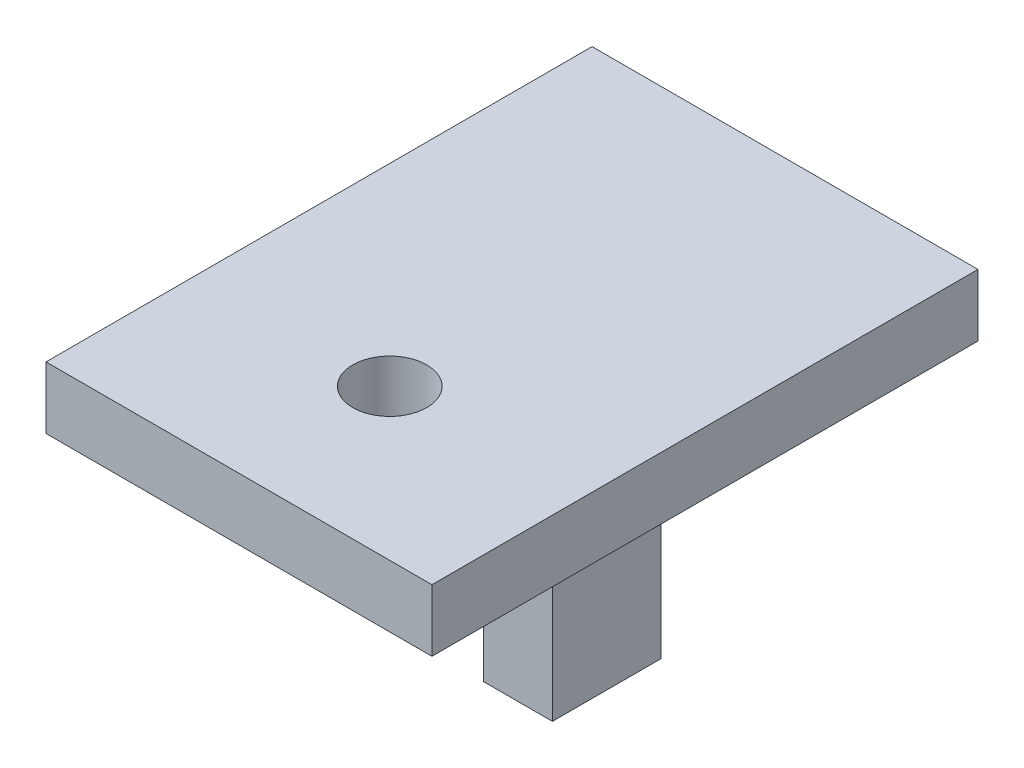
ISO-10303-21;
HEADER;
FILE_DESCRIPTION(('STEP AP214'),'2;1');
FILE_NAME('part.step','',(''),(''),'','','');
FILE_SCHEMA(('AUTOMOTIVE_DESIGN { 1 0 10303 214 1 1 1 1 }'));
ENDSEC;
DATA;
#1=APPLICATION_CONTEXT('core data for automotive mechanical design processes');
#2=APPLICATION_PROTOCOL_DEFINITION('international standard','automotive_design',2000,#1);
#3=PRODUCT_CONTEXT('',#1,'mechanical');
#4=PRODUCT('Part','Part','',(#3));
#5=PRODUCT_RELATED_PRODUCT_CATEGORY('part','',(#4));
#6=PRODUCT_DEFINITION_FORMATION('','',#4);
#7=PRODUCT_DEFINITION_CONTEXT('part definition',#1,'design');
#8=PRODUCT_DEFINITION('design','',#6,#7);
#9=PRODUCT_DEFINITION_SHAPE('','',#8);
#10=(LENGTH_UNIT() NAMED_UNIT(*) SI_UNIT(.MILLI.,.METRE.));
#11=(NAMED_UNIT(*) PLANE_ANGLE_UNIT() SI_UNIT($,.RADIAN.));
#12=(NAMED_UNIT(*) SI_UNIT($,.STERADIAN.) SOLID_ANGLE_UNIT());
#13=UNCERTAINTY_MEASURE_WITH_UNIT(LENGTH_MEASURE(1.E-05),#10,'distance_accuracy_value','');
#14=(GEOMETRIC_REPRESENTATION_CONTEXT(3) GLOBAL_UNCERTAINTY_ASSIGNED_CONTEXT((#13)) GLOBAL_UNIT_ASSIGNED_CONTEXT((#10,
#11,#12)) REPRESENTATION_CONTEXT('',''));
#15=CARTESIAN_POINT('',(0.,0.,0.));
#16=DIRECTION('',(0.,0.,1.));
#17=DIRECTION('',(1.,0.,0.));
#18=AXIS2_PLACEMENT_3D('',#15,#16,#17);
#19=CARTESIAN_POINT('',(0.,0.,0.));
#20=DIRECTION('',(0.,1.,0.));
#21=DIRECTION('',(0.,0.,1.));
#22=AXIS2_PLACEMENT_3D('',#19,#20,#21);
#23=PLANE('',#22);
#24=CARTESIAN_POINT('',(0.,0.,23.217935));
#25=DIRECTION('',(0.,1.,0.));
#26=DIRECTION('',(0.,0.,1.));
#27=AXIS2_PLACEMENT_3D('',#24,#25,#26);
#28=CIRCLE('',#27,5.969);
#29=CARTESIAN_POINT('',(0.,0.,29.186935));
#30=VERTEX_POINT('',#29);
#31=EDGE_CURVE('E121',#30,#30,#28,.T.);
#32=ORIENTED_EDGE('',*,*,#31,.T.);
#33=EDGE_LOOP('',(#32));
#34=FACE_BOUND('',#33,.T.);
#35=DIRECTION('',(0.,0.,1.));
#36=VECTOR('',#35,1.);
#37=CARTESIAN_POINT('',(-20.01,0.,-40.492065));
#38=LINE('',#37,#36);
#39=CARTESIAN_POINT('',(-20.01,0.,-40.492065));
#40=VERTEX_POINT('',#39);
#41=CARTESIAN_POINT('',(-20.01,0.,-23.009425));
#42=VERTEX_POINT('',#41);
#43=EDGE_CURVE('E59',#40,#42,#38,.T.);
#44=ORIENTED_EDGE('',*,*,#43,.F.);
#45=DIRECTION('',(-1.,0.,0.));
#46=VECTOR('',#45,1.);
#47=CARTESIAN_POINT('',(-31.1,0.,-40.492065));
#48=LINE('',#47,#46);
#49=CARTESIAN_POINT('',(31.1,0.,-40.492065));
#50=VERTEX_POINT('',#49);
#51=EDGE_CURVE('E143',#50,#40,#48,.T.);
#52=ORIENTED_EDGE('',*,*,#51,.F.);
#53=DIRECTION('',(0.,0.,-1.));
#54=VECTOR('',#53,1.);
#55=CARTESIAN_POINT('',(31.1,0.,-40.492065));
#56=LINE('',#55,#54);
#57=CARTESIAN_POINT('',(31.1,0.,47.517935));
#58=VERTEX_POINT('',#57);
#59=EDGE_CURVE('E128',#58,#50,#56,.T.);
#60=ORIENTED_EDGE('',*,*,#59,.F.);
#61=DIRECTION('',(1.,0.,0.));
#62=VECTOR('',#61,1.);
#63=CARTESIAN_POINT('',(-31.1,0.,47.517935));
#64=LINE('',#63,#62);
#65=CARTESIAN_POINT('',(-31.1,0.,47.517935));
#66=VERTEX_POINT('',#65);
#67=EDGE_CURVE('E134',#66,#58,#64,.T.);
#68=ORIENTED_EDGE('',*,*,#67,.F.);
#69=DIRECTION('',(0.,0.,1.));
#70=VECTOR('',#69,1.);
#71=CARTESIAN_POINT('',(-31.1,0.,-40.492065));
#72=LINE('',#71,#70);
#73=CARTESIAN_POINT('',(-31.1,0.,-23.009425));
#74=VERTEX_POINT('',#73);
#75=EDGE_CURVE('E145',#74,#66,#72,.T.);
#76=ORIENTED_EDGE('',*,*,#75,.F.);
#77=DIRECTION('',(-1.,0.,0.));
#78=VECTOR('',#77,1.);
#79=CARTESIAN_POINT('',(-20.01,0.,-23.009425));
#80=LINE('',#79,#78);
#81=EDGE_CURVE('E54',#42,#74,#80,.T.);
#82=ORIENTED_EDGE('',*,*,#81,.F.);
#83=EDGE_LOOP('',(#44,#52,#60,#68,#76,#82));
#84=FACE_BOUND('',#83,.T.);
#85=ADVANCED_FACE('F39',(#34,#84),#23,.F.);
#86=CARTESIAN_POINT('',(31.1,10.,-40.492065));
#87=DIRECTION('',(-1.,0.,0.));
#88=DIRECTION('',(0.,0.,1.));
#89=AXIS2_PLACEMENT_3D('',#86,#87,#88);
#90=PLANE('',#89);
#91=ORIENTED_EDGE('',*,*,#59,.T.);
#92=DIRECTION('',(0.,-1.,0.));
#93=VECTOR('',#92,1.);
#94=CARTESIAN_POINT('',(31.1,10.,-40.492065));
#95=LINE('',#94,#93);
#96=CARTESIAN_POINT('',(31.1,10.,-40.492065));
#97=VERTEX_POINT('',#96);
#98=EDGE_CURVE('E11',#97,#50,#95,.T.);
#99=ORIENTED_EDGE('',*,*,#98,.F.);
#100=DIRECTION('',(0.,0.,-1.));
#101=VECTOR('',#100,1.);
#102=CARTESIAN_POINT('',(31.1,10.,-40.492065));
#103=LINE('',#102,#101);
#104=CARTESIAN_POINT('',(31.1,10.,47.517935));
#105=VERTEX_POINT('',#104);
#106=EDGE_CURVE('E130',#105,#97,#103,.T.);
#107=ORIENTED_EDGE('',*,*,#106,.F.);
#108=DIRECTION('',(0.,-1.,0.));
#109=VECTOR('',#108,1.);
#110=CARTESIAN_POINT('',(31.1,10.,47.517935));
#111=LINE('',#110,#109);
#112=EDGE_CURVE('E140',#105,#58,#111,.T.);
#113=ORIENTED_EDGE('',*,*,#112,.T.);
#114=EDGE_LOOP('',(#91,#99,#107,#113));
#115=FACE_BOUND('',#114,.T.);
#116=ADVANCED_FACE('F41',(#115),#90,.F.);
#117=CARTESIAN_POINT('',(-31.1,10.,-40.492065));
#118=DIRECTION('',(0.,0.,1.));
#119=DIRECTION('',(1.,0.,0.));
#120=AXIS2_PLACEMENT_3D('',#117,#118,#119);
#121=PLANE('',#120);
#122=ORIENTED_EDGE('',*,*,#51,.T.);
#123=DIRECTION('',(0.,1.,0.));
#124=VECTOR('',#123,1.);
#125=CARTESIAN_POINT('',(-20.01,-69.9,-40.492065));
#126=LINE('',#125,#124);
#127=CARTESIAN_POINT('',(-20.01,-69.9,-40.492065));
#128=VERTEX_POINT('',#127);
#129=EDGE_CURVE('E123',#128,#40,#126,.T.);
#130=ORIENTED_EDGE('',*,*,#129,.F.);
#131=DIRECTION('',(1.,0.,0.));
#132=VECTOR('',#131,1.);
#133=CARTESIAN_POINT('',(-20.01,-69.9,-40.492065));
#134=LINE('',#133,#132);
#135=CARTESIAN_POINT('',(-31.1,-69.9,-40.492065));
#136=VERTEX_POINT('',#135);
#137=EDGE_CURVE('E112',#136,#128,#134,.T.);
#138=ORIENTED_EDGE('',*,*,#137,.F.);
#139=DIRECTION('',(0.,-1.,0.));
#140=VECTOR('',#139,1.);
#141=CARTESIAN_POINT('',(-31.1,10.,-40.492065));
#142=LINE('',#141,#140);
#143=CARTESIAN_POINT('',(-31.1,10.,-40.492065));
#144=VERTEX_POINT('',#143);
#145=EDGE_CURVE('E47',#144,#136,#142,.T.);
#146=ORIENTED_EDGE('',*,*,#145,.F.);
#147=DIRECTION('',(-1.,0.,0.));
#148=VECTOR('',#147,1.);
#149=CARTESIAN_POINT('',(-31.1,10.,-40.492065));
#150=LINE('',#149,#148);
#151=EDGE_CURVE('E133',#97,#144,#150,.T.);
#152=ORIENTED_EDGE('',*,*,#151,.F.);
#153=ORIENTED_EDGE('',*,*,#98,.T.);
#154=EDGE_LOOP('',(#122,#130,#138,#146,#152,#153));
#155=FACE_BOUND('',#154,.T.);
#156=ADVANCED_FACE('F159',(#155),#121,.F.);
#157=CARTESIAN_POINT('',(-31.1,10.,-40.492065));
#158=DIRECTION('',(1.,0.,0.));
#159=DIRECTION('',(0.,0.,-1.));
#160=AXIS2_PLACEMENT_3D('',#157,#158,#159);
#161=PLANE('',#160);
#162=ORIENTED_EDGE('',*,*,#145,.T.);
#163=DIRECTION('',(0.,0.,-1.));
#164=VECTOR('',#163,1.);
#165=CARTESIAN_POINT('',(-31.1,-69.9,-40.492065));
#166=LINE('',#165,#164);
#167=CARTESIAN_POINT('',(-31.1,-69.9,-23.009425));
#168=VERTEX_POINT('',#167);
#169=EDGE_CURVE('E106',#168,#136,#166,.T.);
#170=ORIENTED_EDGE('',*,*,#169,.F.);
#171=DIRECTION('',(0.,1.,0.));
#172=VECTOR('',#171,1.);
#173=CARTESIAN_POINT('',(-31.1,-69.9,-23.009425));
#174=LINE('',#173,#172);
#175=EDGE_CURVE('E102',#168,#74,#174,.T.);
#176=ORIENTED_EDGE('',*,*,#175,.T.);
#177=ORIENTED_EDGE('',*,*,#75,.T.);
#178=DIRECTION('',(0.,-1.,0.));
#179=VECTOR('',#178,1.);
#180=CARTESIAN_POINT('',(-31.1,10.,47.517935));
#181=LINE('',#180,#179);
#182=CARTESIAN_POINT('',(-31.1,10.,47.517935));
#183=VERTEX_POINT('',#182);
#184=EDGE_CURVE('E150',#183,#66,#181,.T.);
#185=ORIENTED_EDGE('',*,*,#184,.F.);
#186=DIRECTION('',(0.,0.,1.));
#187=VECTOR('',#186,1.);
#188=CARTESIAN_POINT('',(-31.1,10.,-40.492065));
#189=LINE('',#188,#187);
#190=EDGE_CURVE('E136',#144,#183,#189,.T.);
#191=ORIENTED_EDGE('',*,*,#190,.F.);
#192=EDGE_LOOP('',(#162,#170,#176,#177,#185,#191));
#193=FACE_BOUND('',#192,.T.);
#194=ADVANCED_FACE('F155',(#193),#161,.F.);
#195=CARTESIAN_POINT('',(-31.1,10.,47.517935));
#196=DIRECTION('',(0.,0.,-1.));
#197=DIRECTION('',(-1.,0.,0.));
#198=AXIS2_PLACEMENT_3D('',#195,#196,#197);
#199=PLANE('',#198);
#200=ORIENTED_EDGE('',*,*,#67,.T.);
#201=ORIENTED_EDGE('',*,*,#112,.F.);
#202=DIRECTION('',(1.,0.,0.));
#203=VECTOR('',#202,1.);
#204=CARTESIAN_POINT('',(-31.1,10.,47.517935));
#205=LINE('',#204,#203);
#206=EDGE_CURVE('E138',#183,#105,#205,.T.);
#207=ORIENTED_EDGE('',*,*,#206,.F.);
#208=ORIENTED_EDGE('',*,*,#184,.T.);
#209=EDGE_LOOP('',(#200,#201,#207,#208));
#210=FACE_BOUND('',#209,.T.);
#211=ADVANCED_FACE('F166',(#210),#199,.F.);
#212=CARTESIAN_POINT('',(0.,10.,0.));
#213=DIRECTION('',(0.,1.,0.));
#214=DIRECTION('',(0.,0.,1.));
#215=AXIS2_PLACEMENT_3D('',#212,#213,#214);
#216=PLANE('',#215);
#217=CARTESIAN_POINT('',(0.,10.,23.217935));
#218=DIRECTION('',(0.,1.,0.));
#219=DIRECTION('',(0.,0.,1.));
#220=AXIS2_PLACEMENT_3D('',#217,#218,#219);
#221=CIRCLE('',#220,5.969);
#222=CARTESIAN_POINT('',(0.,10.,29.186935));
#223=VERTEX_POINT('',#222);
#224=EDGE_CURVE('E118',#223,#223,#221,.T.);
#225=ORIENTED_EDGE('',*,*,#224,.F.);
#226=EDGE_LOOP('',(#225));
#227=FACE_BOUND('',#226,.T.);
#228=ORIENTED_EDGE('',*,*,#106,.T.);
#229=ORIENTED_EDGE('',*,*,#151,.T.);
#230=ORIENTED_EDGE('',*,*,#190,.T.);
#231=ORIENTED_EDGE('',*,*,#206,.T.);
#232=EDGE_LOOP('',(#228,#229,#230,#231));
#233=FACE_BOUND('',#232,.T.);
#234=ADVANCED_FACE('F173',(#227,#233),#216,.T.);
#235=CARTESIAN_POINT('',(0.,0.,23.217935));
#236=DIRECTION('',(0.,1.,0.));
#237=DIRECTION('',(0.,0.,1.));
#238=AXIS2_PLACEMENT_3D('',#235,#236,#237);
#239=CYLINDRICAL_SURFACE('',#238,5.969);
#240=ORIENTED_EDGE('',*,*,#31,.F.);
#241=EDGE_LOOP('',(#240));
#242=FACE_BOUND('',#241,.T.);
#243=ORIENTED_EDGE('',*,*,#224,.T.);
#244=EDGE_LOOP('',(#243));
#245=FACE_BOUND('',#244,.T.);
#246=ADVANCED_FACE('F175',(#242,#245),#239,.F.);
#247=CARTESIAN_POINT('',(-20.01,-69.9,-40.492065));
#248=DIRECTION('',(-1.,0.,0.));
#249=DIRECTION('',(0.,0.,1.));
#250=AXIS2_PLACEMENT_3D('',#247,#248,#249);
#251=PLANE('',#250);
#252=ORIENTED_EDGE('',*,*,#43,.T.);
#253=DIRECTION('',(0.,1.,0.));
#254=VECTOR('',#253,1.);
#255=CARTESIAN_POINT('',(-20.01,-69.9,-23.009425));
#256=LINE('',#255,#254);
#257=CARTESIAN_POINT('',(-20.01,-69.9,-23.009425));
#258=VERTEX_POINT('',#257);
#259=EDGE_CURVE('E100',#258,#42,#256,.T.);
#260=ORIENTED_EDGE('',*,*,#259,.F.);
#261=DIRECTION('',(0.,0.,1.));
#262=VECTOR('',#261,1.);
#263=CARTESIAN_POINT('',(-20.01,-69.9,-40.492065));
#264=LINE('',#263,#262);
#265=EDGE_CURVE('E107',#128,#258,#264,.T.);
#266=ORIENTED_EDGE('',*,*,#265,.F.);
#267=ORIENTED_EDGE('',*,*,#129,.T.);
#268=EDGE_LOOP('',(#252,#260,#266,#267));
#269=FACE_BOUND('',#268,.T.);
#270=ADVANCED_FACE('F117',(#269),#251,.F.);
#271=CARTESIAN_POINT('',(-20.01,-69.9,-23.009425));
#272=DIRECTION('',(0.,0.,-1.));
#273=DIRECTION('',(-1.,0.,0.));
#274=AXIS2_PLACEMENT_3D('',#271,#272,#273);
#275=PLANE('',#274);
#276=ORIENTED_EDGE('',*,*,#81,.T.);
#277=ORIENTED_EDGE('',*,*,#175,.F.);
#278=DIRECTION('',(-1.,0.,0.));
#279=VECTOR('',#278,1.);
#280=CARTESIAN_POINT('',(-20.01,-69.9,-23.009425));
#281=LINE('',#280,#279);
#282=EDGE_CURVE('E96',#258,#168,#281,.T.);
#283=ORIENTED_EDGE('',*,*,#282,.F.);
#284=ORIENTED_EDGE('',*,*,#259,.T.);
#285=EDGE_LOOP('',(#276,#277,#283,#284));
#286=FACE_BOUND('',#285,.T.);
#287=ADVANCED_FACE('F98',(#286),#275,.F.);
#288=CARTESIAN_POINT('',(0.,-69.9,0.));
#289=DIRECTION('',(0.,-1.,0.));
#290=DIRECTION('',(0.,0.,-1.));
#291=AXIS2_PLACEMENT_3D('',#288,#289,#290);
#292=PLANE('',#291);
#293=ORIENTED_EDGE('',*,*,#265,.T.);
#294=ORIENTED_EDGE('',*,*,#282,.T.);
#295=ORIENTED_EDGE('',*,*,#169,.T.);
#296=ORIENTED_EDGE('',*,*,#137,.T.);
#297=EDGE_LOOP('',(#293,#294,#295,#296));
#298=FACE_BOUND('',#297,.T.);
#299=ADVANCED_FACE('F110',(#298),#292,.T.);
#300=CLOSED_SHELL('',(#85,#116,#156,#194,#211,#234,#246,#270,#287,#299));
#301=MANIFOLD_SOLID_BREP('B2',#300);
#302=ADVANCED_BREP_SHAPE_REPRESENTATION('',(#18,#301),#14);
#303=SHAPE_DEFINITION_REPRESENTATION(#9,#302);
ENDSEC;
END-ISO-10303-21;
